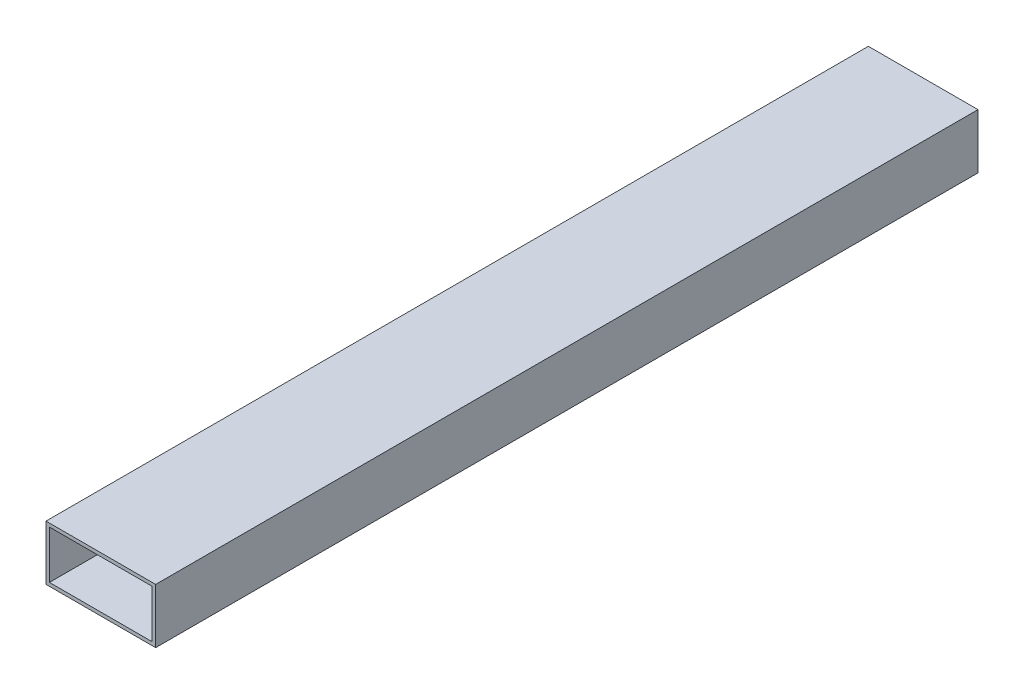
ISO-10303-21;
HEADER;
FILE_DESCRIPTION(('STEP AP214'),'2;1');
FILE_NAME('part.step','',(''),(''),'','','');
FILE_SCHEMA(('AUTOMOTIVE_DESIGN { 1 0 10303 214 1 1 1 1 }'));
ENDSEC;
DATA;
#1=APPLICATION_CONTEXT('core data for automotive mechanical design processes');
#2=APPLICATION_PROTOCOL_DEFINITION('international standard','automotive_design',2000,#1);
#3=PRODUCT_CONTEXT('',#1,'mechanical');
#4=PRODUCT('Part','Part','',(#3));
#5=PRODUCT_RELATED_PRODUCT_CATEGORY('part','',(#4));
#6=PRODUCT_DEFINITION_FORMATION('','',#4);
#7=PRODUCT_DEFINITION_CONTEXT('part definition',#1,'design');
#8=PRODUCT_DEFINITION('design','',#6,#7);
#9=PRODUCT_DEFINITION_SHAPE('','',#8);
#10=(LENGTH_UNIT() NAMED_UNIT(*) SI_UNIT(.MILLI.,.METRE.));
#11=(NAMED_UNIT(*) PLANE_ANGLE_UNIT() SI_UNIT($,.RADIAN.));
#12=(NAMED_UNIT(*) SI_UNIT($,.STERADIAN.) SOLID_ANGLE_UNIT());
#13=UNCERTAINTY_MEASURE_WITH_UNIT(LENGTH_MEASURE(1.E-05),#10,'distance_accuracy_value','');
#14=(GEOMETRIC_REPRESENTATION_CONTEXT(3) GLOBAL_UNCERTAINTY_ASSIGNED_CONTEXT((#13)) GLOBAL_UNIT_ASSIGNED_CONTEXT((#10,
#11,#12)) REPRESENTATION_CONTEXT('',''));
#15=CARTESIAN_POINT('',(0.,0.,0.));
#16=DIRECTION('',(0.,0.,1.));
#17=DIRECTION('',(1.,0.,0.));
#18=AXIS2_PLACEMENT_3D('',#15,#16,#17);
#19=CARTESIAN_POINT('',(0.,0.,381.));
#20=DIRECTION('',(0.,0.,1.));
#21=DIRECTION('',(1.,0.,0.));
#22=AXIS2_PLACEMENT_3D('',#19,#20,#21);
#23=PLANE('',#22);
#24=DIRECTION('',(0.,-1.,0.));
#25=VECTOR('',#24,1.);
#26=CARTESIAN_POINT('',(-25.4,-12.7,381.));
#27=LINE('',#26,#25);
#28=CARTESIAN_POINT('',(-25.4,12.7,381.));
#29=VERTEX_POINT('',#28);
#30=CARTESIAN_POINT('',(-25.4,-12.7,381.));
#31=VERTEX_POINT('',#30);
#32=EDGE_CURVE('E134',#29,#31,#27,.T.);
#33=ORIENTED_EDGE('',*,*,#32,.T.);
#34=DIRECTION('',(1.,0.,0.));
#35=VECTOR('',#34,1.);
#36=CARTESIAN_POINT('',(25.4,-12.7,381.));
#37=LINE('',#36,#35);
#38=CARTESIAN_POINT('',(25.4,-12.7,381.));
#39=VERTEX_POINT('',#38);
#40=EDGE_CURVE('E137',#31,#39,#37,.T.);
#41=ORIENTED_EDGE('',*,*,#40,.T.);
#42=DIRECTION('',(0.,1.,0.));
#43=VECTOR('',#42,1.);
#44=CARTESIAN_POINT('',(25.4,-12.7,381.));
#45=LINE('',#44,#43);
#46=CARTESIAN_POINT('',(25.4,12.7,381.));
#47=VERTEX_POINT('',#46);
#48=EDGE_CURVE('E140',#39,#47,#45,.T.);
#49=ORIENTED_EDGE('',*,*,#48,.T.);
#50=DIRECTION('',(-1.,0.,0.));
#51=VECTOR('',#50,1.);
#52=CARTESIAN_POINT('',(25.4,12.7,381.));
#53=LINE('',#52,#51);
#54=EDGE_CURVE('E142',#47,#29,#53,.T.);
#55=ORIENTED_EDGE('',*,*,#54,.T.);
#56=EDGE_LOOP('',(#33,#41,#49,#55));
#57=FACE_BOUND('',#56,.T.);
#58=DIRECTION('',(1.,0.,0.));
#59=VECTOR('',#58,1.);
#60=CARTESIAN_POINT('',(23.8125,-11.1125,381.));
#61=LINE('',#60,#59);
#62=CARTESIAN_POINT('',(-23.8125,-11.1125,381.));
#63=VERTEX_POINT('',#62);
#64=CARTESIAN_POINT('',(23.8125,-11.1125,381.));
#65=VERTEX_POINT('',#64);
#66=EDGE_CURVE('E106',#63,#65,#61,.T.);
#67=ORIENTED_EDGE('',*,*,#66,.F.);
#68=DIRECTION('',(0.,-1.,0.));
#69=VECTOR('',#68,1.);
#70=CARTESIAN_POINT('',(-23.8125,-11.1125,381.));
#71=LINE('',#70,#69);
#72=CARTESIAN_POINT('',(-23.8125,11.1125,381.));
#73=VERTEX_POINT('',#72);
#74=EDGE_CURVE('E98',#73,#63,#71,.T.);
#75=ORIENTED_EDGE('',*,*,#74,.F.);
#76=DIRECTION('',(-1.,0.,0.));
#77=VECTOR('',#76,1.);
#78=CARTESIAN_POINT('',(23.8125,11.1125,381.));
#79=LINE('',#78,#77);
#80=CARTESIAN_POINT('',(23.8125,11.1125,381.));
#81=VERTEX_POINT('',#80);
#82=EDGE_CURVE('E120',#81,#73,#79,.T.);
#83=ORIENTED_EDGE('',*,*,#82,.F.);
#84=DIRECTION('',(0.,1.,0.));
#85=VECTOR('',#84,1.);
#86=CARTESIAN_POINT('',(23.8125,-11.1125,381.));
#87=LINE('',#86,#85);
#88=EDGE_CURVE('E118',#65,#81,#87,.T.);
#89=ORIENTED_EDGE('',*,*,#88,.F.);
#90=EDGE_LOOP('',(#67,#75,#83,#89));
#91=FACE_BOUND('',#90,.T.);
#92=ADVANCED_FACE('F33',(#57,#91),#23,.T.);
#93=CARTESIAN_POINT('',(0.,0.,0.));
#94=DIRECTION('',(0.,0.,1.));
#95=DIRECTION('',(1.,0.,0.));
#96=AXIS2_PLACEMENT_3D('',#93,#94,#95);
#97=PLANE('',#96);
#98=DIRECTION('',(0.,-1.,0.));
#99=VECTOR('',#98,1.);
#100=CARTESIAN_POINT('',(-25.4,-12.7,0.));
#101=LINE('',#100,#99);
#102=CARTESIAN_POINT('',(-25.4,12.7,0.));
#103=VERTEX_POINT('',#102);
#104=CARTESIAN_POINT('',(-25.4,-12.7,0.));
#105=VERTEX_POINT('',#104);
#106=EDGE_CURVE('E114',#103,#105,#101,.T.);
#107=ORIENTED_EDGE('',*,*,#106,.F.);
#108=DIRECTION('',(-1.,0.,0.));
#109=VECTOR('',#108,1.);
#110=CARTESIAN_POINT('',(25.4,12.7,0.));
#111=LINE('',#110,#109);
#112=CARTESIAN_POINT('',(25.4,12.7,0.));
#113=VERTEX_POINT('',#112);
#114=EDGE_CURVE('E138',#113,#103,#111,.T.);
#115=ORIENTED_EDGE('',*,*,#114,.F.);
#116=DIRECTION('',(0.,1.,0.));
#117=VECTOR('',#116,1.);
#118=CARTESIAN_POINT('',(25.4,-12.7,0.));
#119=LINE('',#118,#117);
#120=CARTESIAN_POINT('',(25.4,-12.7,0.));
#121=VERTEX_POINT('',#120);
#122=EDGE_CURVE('E149',#121,#113,#119,.T.);
#123=ORIENTED_EDGE('',*,*,#122,.F.);
#124=DIRECTION('',(1.,0.,0.));
#125=VECTOR('',#124,1.);
#126=CARTESIAN_POINT('',(25.4,-12.7,0.));
#127=LINE('',#126,#125);
#128=EDGE_CURVE('E147',#105,#121,#127,.T.);
#129=ORIENTED_EDGE('',*,*,#128,.F.);
#130=EDGE_LOOP('',(#107,#115,#123,#129));
#131=FACE_BOUND('',#130,.T.);
#132=DIRECTION('',(0.,-1.,0.));
#133=VECTOR('',#132,1.);
#134=CARTESIAN_POINT('',(-23.8125,-11.1125,0.));
#135=LINE('',#134,#133);
#136=CARTESIAN_POINT('',(-23.8125,11.1125,0.));
#137=VERTEX_POINT('',#136);
#138=CARTESIAN_POINT('',(-23.8125,-11.1125,0.));
#139=VERTEX_POINT('',#138);
#140=EDGE_CURVE('E56',#137,#139,#135,.T.);
#141=ORIENTED_EDGE('',*,*,#140,.T.);
#142=DIRECTION('',(1.,0.,0.));
#143=VECTOR('',#142,1.);
#144=CARTESIAN_POINT('',(23.8125,-11.1125,0.));
#145=LINE('',#144,#143);
#146=CARTESIAN_POINT('',(23.8125,-11.1125,0.));
#147=VERTEX_POINT('',#146);
#148=EDGE_CURVE('E113',#139,#147,#145,.T.);
#149=ORIENTED_EDGE('',*,*,#148,.T.);
#150=DIRECTION('',(0.,1.,0.));
#151=VECTOR('',#150,1.);
#152=CARTESIAN_POINT('',(23.8125,-11.1125,0.));
#153=LINE('',#152,#151);
#154=CARTESIAN_POINT('',(23.8125,11.1125,0.));
#155=VERTEX_POINT('',#154);
#156=EDGE_CURVE('E126',#147,#155,#153,.T.);
#157=ORIENTED_EDGE('',*,*,#156,.T.);
#158=DIRECTION('',(-1.,0.,0.));
#159=VECTOR('',#158,1.);
#160=CARTESIAN_POINT('',(23.8125,11.1125,0.));
#161=LINE('',#160,#159);
#162=EDGE_CURVE('E107',#155,#137,#161,.T.);
#163=ORIENTED_EDGE('',*,*,#162,.T.);
#164=EDGE_LOOP('',(#141,#149,#157,#163));
#165=FACE_BOUND('',#164,.T.);
#166=ADVANCED_FACE('F167',(#131,#165),#97,.F.);
#167=CARTESIAN_POINT('',(-25.4,-12.7,381.));
#168=DIRECTION('',(1.,0.,0.));
#169=DIRECTION('',(0.,0.,-1.));
#170=AXIS2_PLACEMENT_3D('',#167,#168,#169);
#171=PLANE('',#170);
#172=ORIENTED_EDGE('',*,*,#106,.T.);
#173=DIRECTION('',(0.,0.,-1.));
#174=VECTOR('',#173,1.);
#175=CARTESIAN_POINT('',(-25.4,-12.7,381.));
#176=LINE('',#175,#174);
#177=EDGE_CURVE('E11',#31,#105,#176,.T.);
#178=ORIENTED_EDGE('',*,*,#177,.F.);
#179=ORIENTED_EDGE('',*,*,#32,.F.);
#180=DIRECTION('',(0.,0.,-1.));
#181=VECTOR('',#180,1.);
#182=CARTESIAN_POINT('',(-25.4,12.7,381.));
#183=LINE('',#182,#181);
#184=EDGE_CURVE('E144',#29,#103,#183,.T.);
#185=ORIENTED_EDGE('',*,*,#184,.T.);
#186=EDGE_LOOP('',(#172,#178,#179,#185));
#187=FACE_BOUND('',#186,.T.);
#188=ADVANCED_FACE('F35',(#187),#171,.F.);
#189=CARTESIAN_POINT('',(25.4,-12.7,381.));
#190=DIRECTION('',(0.,1.,0.));
#191=DIRECTION('',(-1.,0.,0.));
#192=AXIS2_PLACEMENT_3D('',#189,#190,#191);
#193=PLANE('',#192);
#194=ORIENTED_EDGE('',*,*,#128,.T.);
#195=DIRECTION('',(0.,0.,-1.));
#196=VECTOR('',#195,1.);
#197=CARTESIAN_POINT('',(25.4,-12.7,381.));
#198=LINE('',#197,#196);
#199=EDGE_CURVE('E41',#39,#121,#198,.T.);
#200=ORIENTED_EDGE('',*,*,#199,.F.);
#201=ORIENTED_EDGE('',*,*,#40,.F.);
#202=ORIENTED_EDGE('',*,*,#177,.T.);
#203=EDGE_LOOP('',(#194,#200,#201,#202));
#204=FACE_BOUND('',#203,.T.);
#205=ADVANCED_FACE('F177',(#204),#193,.F.);
#206=CARTESIAN_POINT('',(25.4,-12.7,381.));
#207=DIRECTION('',(-1.,0.,0.));
#208=DIRECTION('',(0.,-1.,0.));
#209=AXIS2_PLACEMENT_3D('',#206,#207,#208);
#210=PLANE('',#209);
#211=ORIENTED_EDGE('',*,*,#122,.T.);
#212=DIRECTION('',(0.,0.,-1.));
#213=VECTOR('',#212,1.);
#214=CARTESIAN_POINT('',(25.4,12.7,381.));
#215=LINE('',#214,#213);
#216=EDGE_CURVE('E154',#47,#113,#215,.T.);
#217=ORIENTED_EDGE('',*,*,#216,.F.);
#218=ORIENTED_EDGE('',*,*,#48,.F.);
#219=ORIENTED_EDGE('',*,*,#199,.T.);
#220=EDGE_LOOP('',(#211,#217,#218,#219));
#221=FACE_BOUND('',#220,.T.);
#222=ADVANCED_FACE('F161',(#221),#210,.F.);
#223=CARTESIAN_POINT('',(25.4,12.7,381.));
#224=DIRECTION('',(0.,-1.,0.));
#225=DIRECTION('',(1.,0.,0.));
#226=AXIS2_PLACEMENT_3D('',#223,#224,#225);
#227=PLANE('',#226);
#228=ORIENTED_EDGE('',*,*,#114,.T.);
#229=ORIENTED_EDGE('',*,*,#184,.F.);
#230=ORIENTED_EDGE('',*,*,#54,.F.);
#231=ORIENTED_EDGE('',*,*,#216,.T.);
#232=EDGE_LOOP('',(#228,#229,#230,#231));
#233=FACE_BOUND('',#232,.T.);
#234=ADVANCED_FACE('F171',(#233),#227,.F.);
#235=CARTESIAN_POINT('',(-23.8125,-11.1125,381.));
#236=DIRECTION('',(1.,0.,0.));
#237=DIRECTION('',(0.,0.,-1.));
#238=AXIS2_PLACEMENT_3D('',#235,#236,#237);
#239=PLANE('',#238);
#240=ORIENTED_EDGE('',*,*,#140,.F.);
#241=DIRECTION('',(0.,0.,-1.));
#242=VECTOR('',#241,1.);
#243=CARTESIAN_POINT('',(-23.8125,11.1125,381.));
#244=LINE('',#243,#242);
#245=EDGE_CURVE('E102',#73,#137,#244,.T.);
#246=ORIENTED_EDGE('',*,*,#245,.F.);
#247=ORIENTED_EDGE('',*,*,#74,.T.);
#248=DIRECTION('',(0.,0.,-1.));
#249=VECTOR('',#248,1.);
#250=CARTESIAN_POINT('',(-23.8125,-11.1125,381.));
#251=LINE('',#250,#249);
#252=EDGE_CURVE('E101',#63,#139,#251,.T.);
#253=ORIENTED_EDGE('',*,*,#252,.T.);
#254=EDGE_LOOP('',(#240,#246,#247,#253));
#255=FACE_BOUND('',#254,.T.);
#256=ADVANCED_FACE('F100',(#255),#239,.T.);
#257=CARTESIAN_POINT('',(23.8125,-11.1125,381.));
#258=DIRECTION('',(0.,1.,0.));
#259=DIRECTION('',(-1.,0.,0.));
#260=AXIS2_PLACEMENT_3D('',#257,#258,#259);
#261=PLANE('',#260);
#262=ORIENTED_EDGE('',*,*,#148,.F.);
#263=ORIENTED_EDGE('',*,*,#252,.F.);
#264=ORIENTED_EDGE('',*,*,#66,.T.);
#265=DIRECTION('',(0.,0.,-1.));
#266=VECTOR('',#265,1.);
#267=CARTESIAN_POINT('',(23.8125,-11.1125,381.));
#268=LINE('',#267,#266);
#269=EDGE_CURVE('E115',#65,#147,#268,.T.);
#270=ORIENTED_EDGE('',*,*,#269,.T.);
#271=EDGE_LOOP('',(#262,#263,#264,#270));
#272=FACE_BOUND('',#271,.T.);
#273=ADVANCED_FACE('F110',(#272),#261,.T.);
#274=CARTESIAN_POINT('',(23.8125,-11.1125,381.));
#275=DIRECTION('',(-1.,0.,0.));
#276=DIRECTION('',(0.,0.,1.));
#277=AXIS2_PLACEMENT_3D('',#274,#275,#276);
#278=PLANE('',#277);
#279=ORIENTED_EDGE('',*,*,#156,.F.);
#280=ORIENTED_EDGE('',*,*,#269,.F.);
#281=ORIENTED_EDGE('',*,*,#88,.T.);
#282=DIRECTION('',(0.,0.,-1.));
#283=VECTOR('',#282,1.);
#284=CARTESIAN_POINT('',(23.8125,11.1125,381.));
#285=LINE('',#284,#283);
#286=EDGE_CURVE('E48',#81,#155,#285,.T.);
#287=ORIENTED_EDGE('',*,*,#286,.T.);
#288=EDGE_LOOP('',(#279,#280,#281,#287));
#289=FACE_BOUND('',#288,.T.);
#290=ADVANCED_FACE('F200',(#289),#278,.T.);
#291=CARTESIAN_POINT('',(23.8125,11.1125,381.));
#292=DIRECTION('',(0.,-1.,0.));
#293=DIRECTION('',(1.,0.,0.));
#294=AXIS2_PLACEMENT_3D('',#291,#292,#293);
#295=PLANE('',#294);
#296=ORIENTED_EDGE('',*,*,#162,.F.);
#297=ORIENTED_EDGE('',*,*,#286,.F.);
#298=ORIENTED_EDGE('',*,*,#82,.T.);
#299=ORIENTED_EDGE('',*,*,#245,.T.);
#300=EDGE_LOOP('',(#296,#297,#298,#299));
#301=FACE_BOUND('',#300,.T.);
#302=ADVANCED_FACE('F204',(#301),#295,.T.);
#303=CLOSED_SHELL('',(#92,#166,#188,#205,#222,#234,#256,#273,#290,#302));
#304=MANIFOLD_SOLID_BREP('B2',#303);
#305=ADVANCED_BREP_SHAPE_REPRESENTATION('',(#18,#304),#14);
#306=SHAPE_DEFINITION_REPRESENTATION(#9,#305);
ENDSEC;
END-ISO-10303-21;
